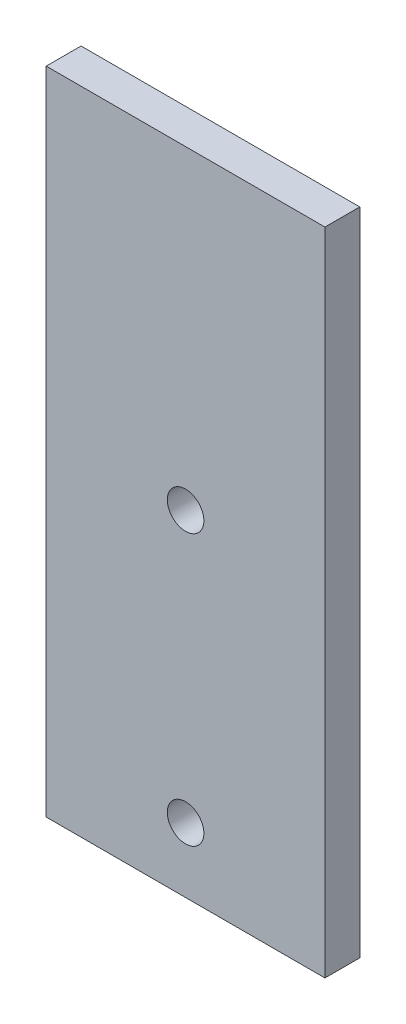
ISO-10303-21;
HEADER;
FILE_DESCRIPTION(('STEP AP214'),'2;1');
FILE_NAME('part.step','',(''),(''),'','','');
FILE_SCHEMA(('AUTOMOTIVE_DESIGN { 1 0 10303 214 1 1 1 1 }'));
ENDSEC;
DATA;
#1=APPLICATION_CONTEXT('core data for automotive mechanical design processes');
#2=APPLICATION_PROTOCOL_DEFINITION('international standard','automotive_design',2000,#1);
#3=PRODUCT_CONTEXT('',#1,'mechanical');
#4=PRODUCT('Part','Part','',(#3));
#5=PRODUCT_RELATED_PRODUCT_CATEGORY('part','',(#4));
#6=PRODUCT_DEFINITION_FORMATION('','',#4);
#7=PRODUCT_DEFINITION_CONTEXT('part definition',#1,'design');
#8=PRODUCT_DEFINITION('design','',#6,#7);
#9=PRODUCT_DEFINITION_SHAPE('','',#8);
#10=(LENGTH_UNIT() NAMED_UNIT(*) SI_UNIT(.MILLI.,.METRE.));
#11=(NAMED_UNIT(*) PLANE_ANGLE_UNIT() SI_UNIT($,.RADIAN.));
#12=(NAMED_UNIT(*) SI_UNIT($,.STERADIAN.) SOLID_ANGLE_UNIT());
#13=UNCERTAINTY_MEASURE_WITH_UNIT(LENGTH_MEASURE(1.E-05),#10,'distance_accuracy_value','');
#14=(GEOMETRIC_REPRESENTATION_CONTEXT(3) GLOBAL_UNCERTAINTY_ASSIGNED_CONTEXT((#13)) GLOBAL_UNIT_ASSIGNED_CONTEXT((#10,
#11,#12)) REPRESENTATION_CONTEXT('',''));
#15=CARTESIAN_POINT('',(0.,0.,0.));
#16=DIRECTION('',(0.,0.,1.));
#17=DIRECTION('',(1.,0.,0.));
#18=AXIS2_PLACEMENT_3D('',#15,#16,#17);
#19=CARTESIAN_POINT('',(0.,0.,4.7625));
#20=DIRECTION('',(0.,0.,-1.));
#21=DIRECTION('',(-1.,0.,0.));
#22=AXIS2_PLACEMENT_3D('',#19,#20,#21);
#23=PLANE('',#22);
#24=DIRECTION('',(0.,-1.,0.));
#25=VECTOR('',#24,1.);
#26=CARTESIAN_POINT('',(0.,0.,4.7625));
#27=LINE('',#26,#25);
#28=CARTESIAN_POINT('',(0.,88.9,4.7625));
#29=VERTEX_POINT('',#28);
#30=CARTESIAN_POINT('',(0.,0.,4.7625));
#31=VERTEX_POINT('',#30);
#32=EDGE_CURVE('E96',#29,#31,#27,.T.);
#33=ORIENTED_EDGE('',*,*,#32,.T.);
#34=DIRECTION('',(1.,0.,0.));
#35=VECTOR('',#34,1.);
#36=CARTESIAN_POINT('',(0.,0.,4.7625));
#37=LINE('',#36,#35);
#38=CARTESIAN_POINT('',(38.1,0.,4.7625));
#39=VERTEX_POINT('',#38);
#40=EDGE_CURVE('E91',#31,#39,#37,.T.);
#41=ORIENTED_EDGE('',*,*,#40,.T.);
#42=DIRECTION('',(0.,1.,0.));
#43=VECTOR('',#42,1.);
#44=CARTESIAN_POINT('',(38.1,0.,4.7625));
#45=LINE('',#44,#43);
#46=CARTESIAN_POINT('',(38.1,88.9,4.7625));
#47=VERTEX_POINT('',#46);
#48=EDGE_CURVE('E94',#39,#47,#45,.T.);
#49=ORIENTED_EDGE('',*,*,#48,.T.);
#50=DIRECTION('',(-1.,0.,0.));
#51=VECTOR('',#50,1.);
#52=CARTESIAN_POINT('',(0.,88.9,4.7625));
#53=LINE('',#52,#51);
#54=EDGE_CURVE('E61',#47,#29,#53,.T.);
#55=ORIENTED_EDGE('',*,*,#54,.T.);
#56=EDGE_LOOP('',(#33,#41,#49,#55));
#57=FACE_BOUND('',#56,.T.);
#58=CARTESIAN_POINT('',(19.05,8.85,4.7625));
#59=DIRECTION('',(0.,0.,1.));
#60=DIRECTION('',(1.,0.,0.));
#61=AXIS2_PLACEMENT_3D('',#58,#59,#60);
#62=CIRCLE('',#61,2.5);
#63=CARTESIAN_POINT('',(16.55,8.85,4.7625));
#64=VERTEX_POINT('',#63);
#65=EDGE_CURVE('E116',#64,#64,#62,.T.);
#66=ORIENTED_EDGE('',*,*,#65,.F.);
#67=EDGE_LOOP('',(#66));
#68=FACE_BOUND('',#67,.T.);
#69=CARTESIAN_POINT('',(19.05,45.85,4.7625));
#70=DIRECTION('',(0.,0.,1.));
#71=DIRECTION('',(1.,0.,0.));
#72=AXIS2_PLACEMENT_3D('',#69,#70,#71);
#73=CIRCLE('',#72,2.5);
#74=CARTESIAN_POINT('',(16.55,45.85,4.7625));
#75=VERTEX_POINT('',#74);
#76=EDGE_CURVE('E138',#75,#75,#73,.T.);
#77=ORIENTED_EDGE('',*,*,#76,.F.);
#78=EDGE_LOOP('',(#77));
#79=FACE_BOUND('',#78,.T.);
#80=ADVANCED_FACE('F43',(#57,#68,#79),#23,.F.);
#81=CARTESIAN_POINT('',(0.,0.,0.));
#82=DIRECTION('',(0.,0.,-1.));
#83=DIRECTION('',(-1.,0.,0.));
#84=AXIS2_PLACEMENT_3D('',#81,#82,#83);
#85=PLANE('',#84);
#86=CARTESIAN_POINT('',(19.05,8.85,0.));
#87=DIRECTION('',(0.,0.,1.));
#88=DIRECTION('',(1.,0.,0.));
#89=AXIS2_PLACEMENT_3D('',#86,#87,#88);
#90=CIRCLE('',#89,2.5);
#91=CARTESIAN_POINT('',(16.55,8.85,0.));
#92=VERTEX_POINT('',#91);
#93=EDGE_CURVE('E134',#92,#92,#90,.T.);
#94=ORIENTED_EDGE('',*,*,#93,.T.);
#95=EDGE_LOOP('',(#94));
#96=FACE_BOUND('',#95,.T.);
#97=DIRECTION('',(0.,-1.,0.));
#98=VECTOR('',#97,1.);
#99=CARTESIAN_POINT('',(0.,0.,0.));
#100=LINE('',#99,#98);
#101=CARTESIAN_POINT('',(0.,88.9,0.));
#102=VERTEX_POINT('',#101);
#103=CARTESIAN_POINT('',(0.,0.,0.));
#104=VERTEX_POINT('',#103);
#105=EDGE_CURVE('E112',#102,#104,#100,.T.);
#106=ORIENTED_EDGE('',*,*,#105,.F.);
#107=DIRECTION('',(-1.,0.,0.));
#108=VECTOR('',#107,1.);
#109=CARTESIAN_POINT('',(0.,88.9,0.));
#110=LINE('',#109,#108);
#111=CARTESIAN_POINT('',(38.1,88.9,0.));
#112=VERTEX_POINT('',#111);
#113=EDGE_CURVE('E84',#112,#102,#110,.T.);
#114=ORIENTED_EDGE('',*,*,#113,.F.);
#115=DIRECTION('',(0.,1.,0.));
#116=VECTOR('',#115,1.);
#117=CARTESIAN_POINT('',(38.1,0.,0.));
#118=LINE('',#117,#116);
#119=CARTESIAN_POINT('',(38.1,0.,0.));
#120=VERTEX_POINT('',#119);
#121=EDGE_CURVE('E78',#120,#112,#118,.T.);
#122=ORIENTED_EDGE('',*,*,#121,.F.);
#123=DIRECTION('',(1.,0.,0.));
#124=VECTOR('',#123,1.);
#125=CARTESIAN_POINT('',(0.,0.,0.));
#126=LINE('',#125,#124);
#127=EDGE_CURVE('E101',#104,#120,#126,.T.);
#128=ORIENTED_EDGE('',*,*,#127,.F.);
#129=EDGE_LOOP('',(#106,#114,#122,#128));
#130=FACE_BOUND('',#129,.T.);
#131=CARTESIAN_POINT('',(19.05,45.85,0.));
#132=DIRECTION('',(0.,0.,1.));
#133=DIRECTION('',(1.,0.,0.));
#134=AXIS2_PLACEMENT_3D('',#131,#132,#133);
#135=CIRCLE('',#134,2.5);
#136=CARTESIAN_POINT('',(16.55,45.85,0.));
#137=VERTEX_POINT('',#136);
#138=EDGE_CURVE('E142',#137,#137,#135,.T.);
#139=ORIENTED_EDGE('',*,*,#138,.T.);
#140=EDGE_LOOP('',(#139));
#141=FACE_BOUND('',#140,.T.);
#142=ADVANCED_FACE('F129',(#96,#130,#141),#85,.T.);
#143=CARTESIAN_POINT('',(0.,0.,4.7625));
#144=DIRECTION('',(1.,0.,0.));
#145=DIRECTION('',(0.,0.,-1.));
#146=AXIS2_PLACEMENT_3D('',#143,#144,#145);
#147=PLANE('',#146);
#148=ORIENTED_EDGE('',*,*,#105,.T.);
#149=DIRECTION('',(0.,0.,-1.));
#150=VECTOR('',#149,1.);
#151=CARTESIAN_POINT('',(0.,0.,4.7625));
#152=LINE('',#151,#150);
#153=EDGE_CURVE('E11',#31,#104,#152,.T.);
#154=ORIENTED_EDGE('',*,*,#153,.F.);
#155=ORIENTED_EDGE('',*,*,#32,.F.);
#156=DIRECTION('',(0.,0.,-1.));
#157=VECTOR('',#156,1.);
#158=CARTESIAN_POINT('',(0.,88.9,4.7625));
#159=LINE('',#158,#157);
#160=EDGE_CURVE('E108',#29,#102,#159,.T.);
#161=ORIENTED_EDGE('',*,*,#160,.T.);
#162=EDGE_LOOP('',(#148,#154,#155,#161));
#163=FACE_BOUND('',#162,.T.);
#164=ADVANCED_FACE('F45',(#163),#147,.F.);
#165=CARTESIAN_POINT('',(0.,0.,4.7625));
#166=DIRECTION('',(0.,1.,0.));
#167=DIRECTION('',(0.,0.,1.));
#168=AXIS2_PLACEMENT_3D('',#165,#166,#167);
#169=PLANE('',#168);
#170=ORIENTED_EDGE('',*,*,#127,.T.);
#171=DIRECTION('',(0.,0.,-1.));
#172=VECTOR('',#171,1.);
#173=CARTESIAN_POINT('',(38.1,0.,4.7625));
#174=LINE('',#173,#172);
#175=EDGE_CURVE('E53',#39,#120,#174,.T.);
#176=ORIENTED_EDGE('',*,*,#175,.F.);
#177=ORIENTED_EDGE('',*,*,#40,.F.);
#178=ORIENTED_EDGE('',*,*,#153,.T.);
#179=EDGE_LOOP('',(#170,#176,#177,#178));
#180=FACE_BOUND('',#179,.T.);
#181=ADVANCED_FACE('F100',(#180),#169,.F.);
#182=CARTESIAN_POINT('',(38.1,0.,4.7625));
#183=DIRECTION('',(-1.,0.,0.));
#184=DIRECTION('',(0.,0.,1.));
#185=AXIS2_PLACEMENT_3D('',#182,#183,#184);
#186=PLANE('',#185);
#187=ORIENTED_EDGE('',*,*,#121,.T.);
#188=DIRECTION('',(0.,0.,-1.));
#189=VECTOR('',#188,1.);
#190=CARTESIAN_POINT('',(38.1,88.9,4.7625));
#191=LINE('',#190,#189);
#192=EDGE_CURVE('E103',#47,#112,#191,.T.);
#193=ORIENTED_EDGE('',*,*,#192,.F.);
#194=ORIENTED_EDGE('',*,*,#48,.F.);
#195=ORIENTED_EDGE('',*,*,#175,.T.);
#196=EDGE_LOOP('',(#187,#193,#194,#195));
#197=FACE_BOUND('',#196,.T.);
#198=ADVANCED_FACE('F104',(#197),#186,.F.);
#199=CARTESIAN_POINT('',(0.,88.9,4.7625));
#200=DIRECTION('',(0.,-1.,0.));
#201=DIRECTION('',(0.,0.,-1.));
#202=AXIS2_PLACEMENT_3D('',#199,#200,#201);
#203=PLANE('',#202);
#204=ORIENTED_EDGE('',*,*,#113,.T.);
#205=ORIENTED_EDGE('',*,*,#160,.F.);
#206=ORIENTED_EDGE('',*,*,#54,.F.);
#207=ORIENTED_EDGE('',*,*,#192,.T.);
#208=EDGE_LOOP('',(#204,#205,#206,#207));
#209=FACE_BOUND('',#208,.T.);
#210=ADVANCED_FACE('F126',(#209),#203,.F.);
#211=CARTESIAN_POINT('',(19.05,8.85,4.7625));
#212=DIRECTION('',(0.,0.,-1.));
#213=DIRECTION('',(-1.,0.,0.));
#214=AXIS2_PLACEMENT_3D('',#211,#212,#213);
#215=CYLINDRICAL_SURFACE('',#214,2.5);
#216=CARTESIAN_POINT('',(16.55,8.85,4.7625));
#217=CARTESIAN_POINT('',(16.55,8.85,4.712890625));
#218=CARTESIAN_POINT('',(16.55,8.85,4.66328125));
#219=CARTESIAN_POINT('',(16.55,8.85,4.5640625));
#220=CARTESIAN_POINT('',(16.55,8.85,4.514453125));
#221=CARTESIAN_POINT('',(16.55,8.85,4.415234375));
#222=CARTESIAN_POINT('',(16.55,8.85,4.365625));
#223=CARTESIAN_POINT('',(16.55,8.85,4.26640625));
#224=CARTESIAN_POINT('',(16.55,8.85,4.216796875));
#225=CARTESIAN_POINT('',(16.55,8.85,4.117578125));
#226=CARTESIAN_POINT('',(16.55,8.85,4.06796875));
#227=CARTESIAN_POINT('',(16.55,8.85,3.96875));
#228=CARTESIAN_POINT('',(16.55,8.85,3.919140625));
#229=CARTESIAN_POINT('',(16.55,8.85,3.819921875));
#230=CARTESIAN_POINT('',(16.55,8.85,3.7703125));
#231=CARTESIAN_POINT('',(16.55,8.85,3.67109375));
#232=CARTESIAN_POINT('',(16.55,8.85,3.621484375));
#233=CARTESIAN_POINT('',(16.55,8.85,3.522265625));
#234=CARTESIAN_POINT('',(16.55,8.85,3.47265625));
#235=CARTESIAN_POINT('',(16.55,8.85,3.3734375));
#236=CARTESIAN_POINT('',(16.55,8.85,3.323828125));
#237=CARTESIAN_POINT('',(16.55,8.85,3.224609375));
#238=CARTESIAN_POINT('',(16.55,8.85,3.175));
#239=CARTESIAN_POINT('',(16.55,8.85,3.07578125));
#240=CARTESIAN_POINT('',(16.55,8.85,3.026171875));
#241=CARTESIAN_POINT('',(16.55,8.85,2.926953125));
#242=CARTESIAN_POINT('',(16.55,8.85,2.87734375));
#243=CARTESIAN_POINT('',(16.55,8.85,2.778125));
#244=CARTESIAN_POINT('',(16.55,8.85,2.728515625));
#245=CARTESIAN_POINT('',(16.55,8.85,2.629296875));
#246=CARTESIAN_POINT('',(16.55,8.85,2.5796875));
#247=CARTESIAN_POINT('',(16.55,8.85,2.48046875));
#248=CARTESIAN_POINT('',(16.55,8.85,2.430859375));
#249=CARTESIAN_POINT('',(16.55,8.85,2.331640625));
#250=CARTESIAN_POINT('',(16.55,8.85,2.28203125));
#251=CARTESIAN_POINT('',(16.55,8.85,2.1828125));
#252=CARTESIAN_POINT('',(16.55,8.85,2.133203125));
#253=CARTESIAN_POINT('',(16.55,8.85,2.033984375));
#254=CARTESIAN_POINT('',(16.55,8.85,1.984375));
#255=CARTESIAN_POINT('',(16.55,8.85,1.88515625));
#256=CARTESIAN_POINT('',(16.55,8.85,1.835546875));
#257=CARTESIAN_POINT('',(16.55,8.85,1.736328125));
#258=CARTESIAN_POINT('',(16.55,8.85,1.68671875));
#259=CARTESIAN_POINT('',(16.55,8.85,1.5875));
#260=CARTESIAN_POINT('',(16.55,8.85,1.537890625));
#261=CARTESIAN_POINT('',(16.55,8.85,1.438671875));
#262=CARTESIAN_POINT('',(16.55,8.85,1.3890625));
#263=CARTESIAN_POINT('',(16.55,8.85,1.28984375));
#264=CARTESIAN_POINT('',(16.55,8.85,1.240234375));
#265=CARTESIAN_POINT('',(16.55,8.85,1.141015625));
#266=CARTESIAN_POINT('',(16.55,8.85,1.09140625));
#267=CARTESIAN_POINT('',(16.55,8.85,0.992187499999999));
#268=CARTESIAN_POINT('',(16.55,8.85,0.942578124999999));
#269=CARTESIAN_POINT('',(16.55,8.85,0.843359375));
#270=CARTESIAN_POINT('',(16.55,8.85,0.79375));
#271=CARTESIAN_POINT('',(16.55,8.85,0.69453125));
#272=CARTESIAN_POINT('',(16.55,8.85,0.644921875));
#273=CARTESIAN_POINT('',(16.55,8.85,0.545703125));
#274=CARTESIAN_POINT('',(16.55,8.85,0.49609375));
#275=CARTESIAN_POINT('',(16.55,8.85,0.396875));
#276=CARTESIAN_POINT('',(16.55,8.85,0.347265625));
#277=CARTESIAN_POINT('',(16.55,8.85,0.248046875));
#278=CARTESIAN_POINT('',(16.55,8.85,0.1984375));
#279=CARTESIAN_POINT('',(16.55,8.85,0.09921875));
#280=CARTESIAN_POINT('',(16.55,8.85,0.049609375));
#281=CARTESIAN_POINT('',(16.55,8.85,0.));
#282=B_SPLINE_CURVE_WITH_KNOTS('',3,(#216,#217,#218,#219,#220,#221,#222,#223,#224,#225,#226,
#227,#228,#229,#230,#231,#232,#233,#234,#235,#236,#237,#238,#239,#240,#241,#242,#243,#244,#245,
#246,#247,#248,#249,#250,#251,#252,#253,#254,#255,#256,#257,#258,#259,#260,#261,#262,#263,#264,
#265,#266,#267,#268,#269,#270,#271,#272,#273,#274,#275,#276,#277,#278,#279,#280,#281),
.UNSPECIFIED.,.F.,.F.,(4,2,2,2,2,2,2,2,2,2,2,2,2,2,2,2,2,2,2,2,2,2,2,2,2,2,2,2,2,2,2,2,4),(0.,
0.148828125,0.29765625,0.446484375,0.5953125,0.744140625,0.892968750000001,1.041796875,1.190625,
1.339453125,1.48828125,1.637109375,1.7859375,1.934765625,2.08359375,2.232421875,2.38125,
2.530078125,2.67890625,2.827734375,2.9765625,3.125390625,3.27421875,3.423046875,3.571875,
3.720703125,3.86953125,4.018359375,4.1671875,4.316015625,4.46484375,4.613671875,4.7625),.UNSPECIFIED.);
#283=EDGE_CURVE('BSEAM161',#64,#92,#282,.T.);
#284=ORIENTED_EDGE('',*,*,#65,.T.);
#285=ORIENTED_EDGE('',*,*,#93,.F.);
#286=ORIENTED_EDGE('',*,*,#283,.T.);
#287=ORIENTED_EDGE('',*,*,#283,.F.);
#288=EDGE_LOOP('',(#284,#286,#285,#287));
#289=FACE_BOUND('',#288,.T.);
#290=ADVANCED_FACE('F161',(#289),#215,.F.);
#291=CARTESIAN_POINT('',(19.05,45.85,4.7625));
#292=DIRECTION('',(0.,0.,-1.));
#293=DIRECTION('',(-1.,0.,0.));
#294=AXIS2_PLACEMENT_3D('',#291,#292,#293);
#295=CYLINDRICAL_SURFACE('',#294,2.5);
#296=CARTESIAN_POINT('',(16.55,45.85,4.7625));
#297=CARTESIAN_POINT('',(16.55,45.85,4.712890625));
#298=CARTESIAN_POINT('',(16.55,45.85,4.66328125));
#299=CARTESIAN_POINT('',(16.55,45.85,4.5640625));
#300=CARTESIAN_POINT('',(16.55,45.85,4.514453125));
#301=CARTESIAN_POINT('',(16.55,45.85,4.415234375));
#302=CARTESIAN_POINT('',(16.55,45.85,4.365625));
#303=CARTESIAN_POINT('',(16.55,45.85,4.26640625));
#304=CARTESIAN_POINT('',(16.55,45.85,4.216796875));
#305=CARTESIAN_POINT('',(16.55,45.85,4.117578125));
#306=CARTESIAN_POINT('',(16.55,45.85,4.06796875));
#307=CARTESIAN_POINT('',(16.55,45.85,3.96875));
#308=CARTESIAN_POINT('',(16.55,45.85,3.919140625));
#309=CARTESIAN_POINT('',(16.55,45.85,3.819921875));
#310=CARTESIAN_POINT('',(16.55,45.85,3.7703125));
#311=CARTESIAN_POINT('',(16.55,45.85,3.67109375));
#312=CARTESIAN_POINT('',(16.55,45.85,3.621484375));
#313=CARTESIAN_POINT('',(16.55,45.85,3.522265625));
#314=CARTESIAN_POINT('',(16.55,45.85,3.47265625));
#315=CARTESIAN_POINT('',(16.55,45.85,3.3734375));
#316=CARTESIAN_POINT('',(16.55,45.85,3.323828125));
#317=CARTESIAN_POINT('',(16.55,45.85,3.224609375));
#318=CARTESIAN_POINT('',(16.55,45.85,3.175));
#319=CARTESIAN_POINT('',(16.55,45.85,3.07578125));
#320=CARTESIAN_POINT('',(16.55,45.85,3.026171875));
#321=CARTESIAN_POINT('',(16.55,45.85,2.926953125));
#322=CARTESIAN_POINT('',(16.55,45.85,2.87734375));
#323=CARTESIAN_POINT('',(16.55,45.85,2.778125));
#324=CARTESIAN_POINT('',(16.55,45.85,2.728515625));
#325=CARTESIAN_POINT('',(16.55,45.85,2.629296875));
#326=CARTESIAN_POINT('',(16.55,45.85,2.5796875));
#327=CARTESIAN_POINT('',(16.55,45.85,2.48046875));
#328=CARTESIAN_POINT('',(16.55,45.85,2.430859375));
#329=CARTESIAN_POINT('',(16.55,45.85,2.331640625));
#330=CARTESIAN_POINT('',(16.55,45.85,2.28203125));
#331=CARTESIAN_POINT('',(16.55,45.85,2.1828125));
#332=CARTESIAN_POINT('',(16.55,45.85,2.133203125));
#333=CARTESIAN_POINT('',(16.55,45.85,2.033984375));
#334=CARTESIAN_POINT('',(16.55,45.85,1.984375));
#335=CARTESIAN_POINT('',(16.55,45.85,1.88515625));
#336=CARTESIAN_POINT('',(16.55,45.85,1.835546875));
#337=CARTESIAN_POINT('',(16.55,45.85,1.736328125));
#338=CARTESIAN_POINT('',(16.55,45.85,1.68671875));
#339=CARTESIAN_POINT('',(16.55,45.85,1.5875));
#340=CARTESIAN_POINT('',(16.55,45.85,1.537890625));
#341=CARTESIAN_POINT('',(16.55,45.85,1.438671875));
#342=CARTESIAN_POINT('',(16.55,45.85,1.3890625));
#343=CARTESIAN_POINT('',(16.55,45.85,1.28984375));
#344=CARTESIAN_POINT('',(16.55,45.85,1.240234375));
#345=CARTESIAN_POINT('',(16.55,45.85,1.141015625));
#346=CARTESIAN_POINT('',(16.55,45.85,1.09140625));
#347=CARTESIAN_POINT('',(16.55,45.85,0.992187499999999));
#348=CARTESIAN_POINT('',(16.55,45.85,0.942578124999999));
#349=CARTESIAN_POINT('',(16.55,45.85,0.843359375));
#350=CARTESIAN_POINT('',(16.55,45.85,0.79375));
#351=CARTESIAN_POINT('',(16.55,45.85,0.69453125));
#352=CARTESIAN_POINT('',(16.55,45.85,0.644921875));
#353=CARTESIAN_POINT('',(16.55,45.85,0.545703125));
#354=CARTESIAN_POINT('',(16.55,45.85,0.49609375));
#355=CARTESIAN_POINT('',(16.55,45.85,0.396875));
#356=CARTESIAN_POINT('',(16.55,45.85,0.347265625));
#357=CARTESIAN_POINT('',(16.55,45.85,0.248046875));
#358=CARTESIAN_POINT('',(16.55,45.85,0.1984375));
#359=CARTESIAN_POINT('',(16.55,45.85,0.09921875));
#360=CARTESIAN_POINT('',(16.55,45.85,0.049609375));
#361=CARTESIAN_POINT('',(16.55,45.85,0.));
#362=B_SPLINE_CURVE_WITH_KNOTS('',3,(#296,#297,#298,#299,#300,#301,#302,#303,#304,#305,#306,
#307,#308,#309,#310,#311,#312,#313,#314,#315,#316,#317,#318,#319,#320,#321,#322,#323,#324,#325,
#326,#327,#328,#329,#330,#331,#332,#333,#334,#335,#336,#337,#338,#339,#340,#341,#342,#343,#344,
#345,#346,#347,#348,#349,#350,#351,#352,#353,#354,#355,#356,#357,#358,#359,#360,#361),
.UNSPECIFIED.,.F.,.F.,(4,2,2,2,2,2,2,2,2,2,2,2,2,2,2,2,2,2,2,2,2,2,2,2,2,2,2,2,2,2,2,2,4),(0.,
0.148828125,0.29765625,0.446484375,0.5953125,0.744140625,0.892968750000001,1.041796875,1.190625,
1.339453125,1.48828125,1.637109375,1.7859375,1.934765625,2.08359375,2.232421875,2.38125,
2.530078125,2.67890625,2.827734375,2.9765625,3.125390625,3.27421875,3.423046875,3.571875,
3.720703125,3.86953125,4.018359375,4.1671875,4.316015625,4.46484375,4.613671875,4.7625),.UNSPECIFIED.);
#363=EDGE_CURVE('BSEAM150',#75,#137,#362,.T.);
#364=ORIENTED_EDGE('',*,*,#76,.T.);
#365=ORIENTED_EDGE('',*,*,#138,.F.);
#366=ORIENTED_EDGE('',*,*,#363,.T.);
#367=ORIENTED_EDGE('',*,*,#363,.F.);
#368=EDGE_LOOP('',(#364,#366,#365,#367));
#369=FACE_BOUND('',#368,.T.);
#370=ADVANCED_FACE('F150',(#369),#295,.F.);
#371=CLOSED_SHELL('',(#80,#142,#164,#181,#198,#210,#290,#370));
#372=MANIFOLD_SOLID_BREP('B2',#371);
#373=ADVANCED_BREP_SHAPE_REPRESENTATION('',(#18,#372),#14);
#374=SHAPE_DEFINITION_REPRESENTATION(#9,#373);
ENDSEC;
END-ISO-10303-21;
